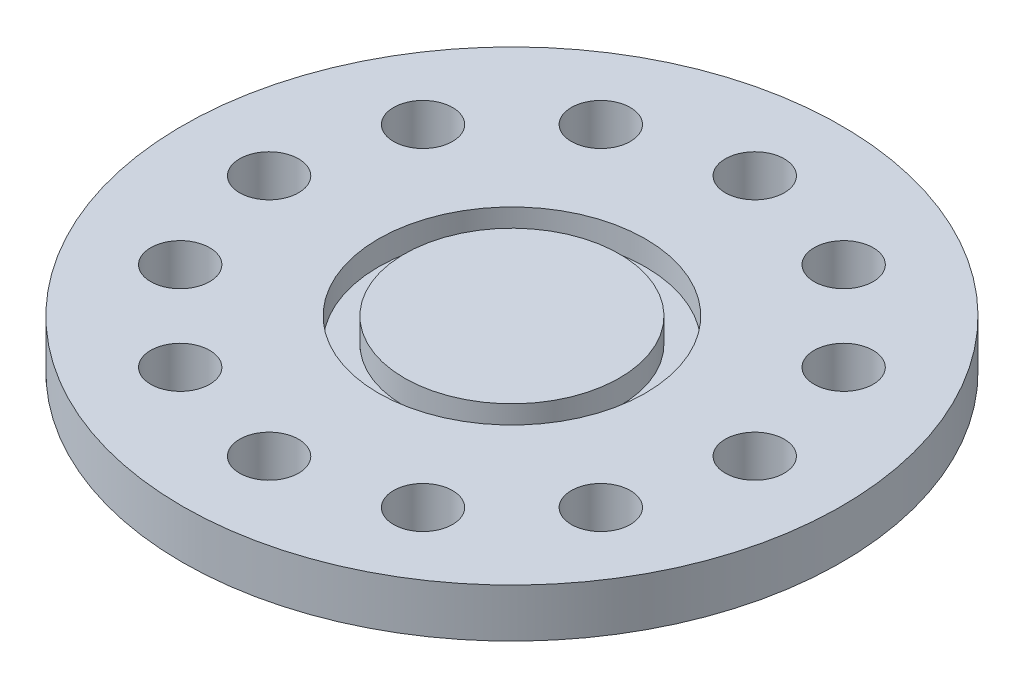
ISO-10303-21;
HEADER;
FILE_DESCRIPTION(('STEP AP214'),'2;1');
FILE_NAME('part.step','',(''),(''),'','','');
FILE_SCHEMA(('AUTOMOTIVE_DESIGN { 1 0 10303 214 1 1 1 1 }'));
ENDSEC;
DATA;
#1=APPLICATION_CONTEXT('core data for automotive mechanical design processes');
#2=APPLICATION_PROTOCOL_DEFINITION('international standard','automotive_design',2000,#1);
#3=PRODUCT_CONTEXT('',#1,'mechanical');
#4=PRODUCT('Part','Part','',(#3));
#5=PRODUCT_RELATED_PRODUCT_CATEGORY('part','',(#4));
#6=PRODUCT_DEFINITION_FORMATION('','',#4);
#7=PRODUCT_DEFINITION_CONTEXT('part definition',#1,'design');
#8=PRODUCT_DEFINITION('design','',#6,#7);
#9=PRODUCT_DEFINITION_SHAPE('','',#8);
#10=(LENGTH_UNIT() NAMED_UNIT(*) SI_UNIT(.MILLI.,.METRE.));
#11=(NAMED_UNIT(*) PLANE_ANGLE_UNIT() SI_UNIT($,.RADIAN.));
#12=(NAMED_UNIT(*) SI_UNIT($,.STERADIAN.) SOLID_ANGLE_UNIT());
#13=UNCERTAINTY_MEASURE_WITH_UNIT(LENGTH_MEASURE(1.E-05),#10,'distance_accuracy_value','');
#14=(GEOMETRIC_REPRESENTATION_CONTEXT(3) GLOBAL_UNCERTAINTY_ASSIGNED_CONTEXT((#13)) GLOBAL_UNIT_ASSIGNED_CONTEXT((#10,
#11,#12)) REPRESENTATION_CONTEXT('',''));
#15=CARTESIAN_POINT('',(0.,0.,0.));
#16=DIRECTION('',(0.,0.,1.));
#17=DIRECTION('',(1.,0.,0.));
#18=AXIS2_PLACEMENT_3D('',#15,#16,#17);
#19=CARTESIAN_POINT('',(0.,0.,0.));
#20=DIRECTION('',(0.,1.,0.));
#21=DIRECTION('',(0.,0.,1.));
#22=AXIS2_PLACEMENT_3D('',#19,#20,#21);
#23=PLANE('',#22);
#24=CARTESIAN_POINT('',(-3.50000000000008,0.,-6.06217782649107));
#25=DIRECTION('',(0.,1.,0.));
#26=DIRECTION('',(0.,0.,1.));
#27=AXIS2_PLACEMENT_3D('',#24,#25,#26);
#28=CIRCLE('',#27,0.850000000000142);
#29=CARTESIAN_POINT('',(-3.50000000000008,0.,-5.21217782649093));
#30=VERTEX_POINT('',#29);
#31=EDGE_CURVE('E110',#30,#30,#28,.T.);
#32=ORIENTED_EDGE('',*,*,#31,.T.);
#33=EDGE_LOOP('',(#32));
#34=FACE_BOUND('',#33,.T.);
#35=CARTESIAN_POINT('',(-6.06217782649122,0.,-3.49999999999996));
#36=DIRECTION('',(0.,1.,0.));
#37=DIRECTION('',(0.,0.,1.));
#38=AXIS2_PLACEMENT_3D('',#35,#36,#37);
#39=CIRCLE('',#38,0.850000000000153);
#40=CARTESIAN_POINT('',(-6.06217782649122,0.,-2.64999999999981));
#41=VERTEX_POINT('',#40);
#42=EDGE_CURVE('E116',#41,#41,#39,.T.);
#43=ORIENTED_EDGE('',*,*,#42,.T.);
#44=EDGE_LOOP('',(#43));
#45=FACE_BOUND('',#44,.T.);
#46=CARTESIAN_POINT('',(-7.00000000000019,0.,1.05656802751314E-13));
#47=DIRECTION('',(0.,1.,0.));
#48=DIRECTION('',(0.,0.,1.));
#49=AXIS2_PLACEMENT_3D('',#46,#47,#48);
#50=CIRCLE('',#49,0.850000000000116);
#51=CARTESIAN_POINT('',(-7.00000000000019,0.,0.850000000000221));
#52=VERTEX_POINT('',#51);
#53=EDGE_CURVE('E122',#52,#52,#50,.T.);
#54=ORIENTED_EDGE('',*,*,#53,.T.);
#55=EDGE_LOOP('',(#54));
#56=FACE_BOUND('',#55,.T.);
#57=CARTESIAN_POINT('',(-6.06217782649126,0.,3.50000000000019));
#58=DIRECTION('',(0.,1.,0.));
#59=DIRECTION('',(0.,0.,1.));
#60=AXIS2_PLACEMENT_3D('',#57,#58,#59);
#61=CIRCLE('',#60,0.850000000000052);
#62=CARTESIAN_POINT('',(-6.06217782649126,0.,4.35000000000024));
#63=VERTEX_POINT('',#62);
#64=EDGE_CURVE('E128',#63,#63,#61,.T.);
#65=ORIENTED_EDGE('',*,*,#64,.T.);
#66=EDGE_LOOP('',(#65));
#67=FACE_BOUND('',#66,.T.);
#68=CARTESIAN_POINT('',(-3.50000000000015,0.,6.06217782649133));
#69=DIRECTION('',(0.,1.,0.));
#70=DIRECTION('',(0.,0.,1.));
#71=AXIS2_PLACEMENT_3D('',#68,#69,#70);
#72=CIRCLE('',#71,0.849999999999964);
#73=CARTESIAN_POINT('',(-3.50000000000015,0.,6.91217782649129));
#74=VERTEX_POINT('',#73);
#75=EDGE_CURVE('E134',#74,#74,#72,.T.);
#76=ORIENTED_EDGE('',*,*,#75,.T.);
#77=EDGE_LOOP('',(#76));
#78=FACE_BOUND('',#77,.T.);
#79=CARTESIAN_POINT('',(0.,0.,7.00000000000029));
#80=DIRECTION('',(0.,1.,0.));
#81=DIRECTION('',(0.,0.,1.));
#82=AXIS2_PLACEMENT_3D('',#79,#80,#81);
#83=CIRCLE('',#82,0.849999999999879);
#84=CARTESIAN_POINT('',(0.,0.,7.85000000000017));
#85=VERTEX_POINT('',#84);
#86=EDGE_CURVE('E140',#85,#85,#83,.T.);
#87=ORIENTED_EDGE('',*,*,#86,.T.);
#88=EDGE_LOOP('',(#87));
#89=FACE_BOUND('',#88,.T.);
#90=CARTESIAN_POINT('',(3.5,0.,6.06217782649137));
#91=DIRECTION('',(0.,1.,0.));
#92=DIRECTION('',(0.,0.,1.));
#93=AXIS2_PLACEMENT_3D('',#90,#91,#92);
#94=CIRCLE('',#93,0.849999999999821);
#95=CARTESIAN_POINT('',(3.5,0.,6.91217782649119));
#96=VERTEX_POINT('',#95);
#97=EDGE_CURVE('E146',#96,#96,#94,.T.);
#98=ORIENTED_EDGE('',*,*,#97,.T.);
#99=EDGE_LOOP('',(#98));
#100=FACE_BOUND('',#99,.T.);
#101=CARTESIAN_POINT('',(6.06217782649114,0.,3.50000000000026));
#102=DIRECTION('',(0.,1.,0.));
#103=DIRECTION('',(0.,0.,1.));
#104=AXIS2_PLACEMENT_3D('',#101,#102,#103);
#105=CIRCLE('',#104,0.849999999999796);
#106=CARTESIAN_POINT('',(6.06217782649114,0.,4.35000000000005));
#107=VERTEX_POINT('',#106);
#108=EDGE_CURVE('E152',#107,#107,#105,.T.);
#109=ORIENTED_EDGE('',*,*,#108,.T.);
#110=EDGE_LOOP('',(#109));
#111=FACE_BOUND('',#110,.T.);
#112=CARTESIAN_POINT('',(7.0000000000001,0.,1.90103440924144E-13));
#113=DIRECTION('',(0.,1.,0.));
#114=DIRECTION('',(0.,0.,1.));
#115=AXIS2_PLACEMENT_3D('',#112,#113,#114);
#116=CIRCLE('',#115,0.849999999999811);
#117=CARTESIAN_POINT('',(7.0000000000001,0.,0.850000000000001));
#118=VERTEX_POINT('',#117);
#119=EDGE_CURVE('E158',#118,#118,#116,.T.);
#120=ORIENTED_EDGE('',*,*,#119,.T.);
#121=EDGE_LOOP('',(#120));
#122=FACE_BOUND('',#121,.T.);
#123=CARTESIAN_POINT('',(6.06217782649118,0.,-3.49999999999989));
#124=DIRECTION('',(0.,1.,0.));
#125=DIRECTION('',(0.,0.,1.));
#126=AXIS2_PLACEMENT_3D('',#123,#124,#125);
#127=CIRCLE('',#126,0.849999999999862);
#128=CARTESIAN_POINT('',(6.06217782649118,0.,-2.65000000000003));
#129=VERTEX_POINT('',#128);
#130=EDGE_CURVE('E164',#129,#129,#127,.T.);
#131=ORIENTED_EDGE('',*,*,#130,.T.);
#132=EDGE_LOOP('',(#131));
#133=FACE_BOUND('',#132,.T.);
#134=CARTESIAN_POINT('',(3.50000000000007,0.,-6.06217782649103));
#135=DIRECTION('',(0.,1.,0.));
#136=DIRECTION('',(0.,0.,1.));
#137=AXIS2_PLACEMENT_3D('',#134,#135,#136);
#138=CIRCLE('',#137,0.849999999999929);
#139=CARTESIAN_POINT('',(3.50000000000007,0.,-5.2121778264911));
#140=VERTEX_POINT('',#139);
#141=EDGE_CURVE('E170',#140,#140,#138,.T.);
#142=ORIENTED_EDGE('',*,*,#141,.T.);
#143=EDGE_LOOP('',(#142));
#144=FACE_BOUND('',#143,.T.);
#145=CARTESIAN_POINT('',(0.,0.,-7.));
#146=DIRECTION('',(0.,1.,0.));
#147=DIRECTION('',(0.,0.,1.));
#148=AXIS2_PLACEMENT_3D('',#145,#146,#147);
#149=CIRCLE('',#148,0.85);
#150=CARTESIAN_POINT('',(0.,0.,-6.15));
#151=VERTEX_POINT('',#150);
#152=EDGE_CURVE('E176',#151,#151,#149,.T.);
#153=ORIENTED_EDGE('',*,*,#152,.T.);
#154=EDGE_LOOP('',(#153));
#155=FACE_BOUND('',#154,.T.);
#156=CARTESIAN_POINT('',(0.,0.,0.));
#157=DIRECTION('',(0.,1.,0.));
#158=DIRECTION('',(0.,0.,1.));
#159=AXIS2_PLACEMENT_3D('',#156,#157,#158);
#160=CIRCLE('',#159,9.5);
#161=CARTESIAN_POINT('',(0.,0.,9.5));
#162=VERTEX_POINT('',#161);
#163=EDGE_CURVE('E37',#162,#162,#160,.T.);
#164=ORIENTED_EDGE('',*,*,#163,.F.);
#165=EDGE_LOOP('',(#164));
#166=FACE_BOUND('',#165,.T.);
#167=CARTESIAN_POINT('',(0.,0.,0.));
#168=DIRECTION('',(0.,-1.,0.));
#169=DIRECTION('',(0.,0.,-1.));
#170=AXIS2_PLACEMENT_3D('',#167,#168,#169);
#171=CIRCLE('',#170,3.);
#172=CARTESIAN_POINT('',(-0.8,0.,2.89136645896019));
#173=VERTEX_POINT('',#172);
#174=CARTESIAN_POINT('',(0.8,0.,2.89136645896019));
#175=VERTEX_POINT('',#174);
#176=EDGE_CURVE('E94',#173,#175,#171,.T.);
#177=ORIENTED_EDGE('',*,*,#176,.F.);
#178=DIRECTION('',(0.,0.,-1.));
#179=VECTOR('',#178,1.);
#180=CARTESIAN_POINT('',(-0.8,0.,2.89136645896019));
#181=LINE('',#180,#179);
#182=CARTESIAN_POINT('',(-0.8,0.,3.8));
#183=VERTEX_POINT('',#182);
#184=EDGE_CURVE('E91',#183,#173,#181,.T.);
#185=ORIENTED_EDGE('',*,*,#184,.F.);
#186=DIRECTION('',(-1.,0.,0.));
#187=VECTOR('',#186,1.);
#188=CARTESIAN_POINT('',(-0.8,0.,3.8));
#189=LINE('',#188,#187);
#190=CARTESIAN_POINT('',(0.8,0.,3.8));
#191=VERTEX_POINT('',#190);
#192=EDGE_CURVE('E53',#191,#183,#189,.T.);
#193=ORIENTED_EDGE('',*,*,#192,.F.);
#194=DIRECTION('',(0.,0.,1.));
#195=VECTOR('',#194,1.);
#196=CARTESIAN_POINT('',(0.8,0.,3.8));
#197=LINE('',#196,#195);
#198=EDGE_CURVE('E48',#175,#191,#197,.T.);
#199=ORIENTED_EDGE('',*,*,#198,.F.);
#200=EDGE_LOOP('',(#177,#185,#193,#199));
#201=FACE_BOUND('',#200,.T.);
#202=ADVANCED_FACE('F33',(#34,#45,#56,#67,#78,#89,#100,#111,#122,#133,#144,#155,#166,#201),#23,.F.);
#203=CARTESIAN_POINT('',(0.,1.4,0.));
#204=DIRECTION('',(0.,1.,0.));
#205=DIRECTION('',(0.,0.,1.));
#206=AXIS2_PLACEMENT_3D('',#203,#204,#205);
#207=PLANE('',#206);
#208=CARTESIAN_POINT('',(0.,1.4,0.));
#209=DIRECTION('',(0.,1.,0.));
#210=DIRECTION('',(0.,0.,1.));
#211=AXIS2_PLACEMENT_3D('',#208,#209,#210);
#212=CIRCLE('',#211,3.85);
#213=CARTESIAN_POINT('',(0.,1.4,3.85));
#214=VERTEX_POINT('',#213);
#215=EDGE_CURVE('E105',#214,#214,#212,.T.);
#216=ORIENTED_EDGE('',*,*,#215,.F.);
#217=EDGE_LOOP('',(#216));
#218=FACE_BOUND('',#217,.T.);
#219=CARTESIAN_POINT('',(-6.06217782649122,1.4,-3.49999999999996));
#220=DIRECTION('',(0.,1.,0.));
#221=DIRECTION('',(0.,0.,1.));
#222=AXIS2_PLACEMENT_3D('',#219,#220,#221);
#223=CIRCLE('',#222,0.850000000000153);
#224=CARTESIAN_POINT('',(-6.06217782649122,1.4,-2.64999999999981));
#225=VERTEX_POINT('',#224);
#226=EDGE_CURVE('E119',#225,#225,#223,.T.);
#227=ORIENTED_EDGE('',*,*,#226,.F.);
#228=EDGE_LOOP('',(#227));
#229=FACE_BOUND('',#228,.T.);
#230=CARTESIAN_POINT('',(-6.06217782649126,1.4,3.50000000000019));
#231=DIRECTION('',(0.,1.,0.));
#232=DIRECTION('',(0.,0.,1.));
#233=AXIS2_PLACEMENT_3D('',#230,#231,#232);
#234=CIRCLE('',#233,0.850000000000052);
#235=CARTESIAN_POINT('',(-6.06217782649126,1.4,4.35000000000024));
#236=VERTEX_POINT('',#235);
#237=EDGE_CURVE('E131',#236,#236,#234,.T.);
#238=ORIENTED_EDGE('',*,*,#237,.F.);
#239=EDGE_LOOP('',(#238));
#240=FACE_BOUND('',#239,.T.);
#241=CARTESIAN_POINT('',(0.,1.4,7.00000000000029));
#242=DIRECTION('',(0.,1.,0.));
#243=DIRECTION('',(0.,0.,1.));
#244=AXIS2_PLACEMENT_3D('',#241,#242,#243);
#245=CIRCLE('',#244,0.849999999999879);
#246=CARTESIAN_POINT('',(0.,1.4,7.85000000000017));
#247=VERTEX_POINT('',#246);
#248=EDGE_CURVE('E143',#247,#247,#245,.T.);
#249=ORIENTED_EDGE('',*,*,#248,.F.);
#250=EDGE_LOOP('',(#249));
#251=FACE_BOUND('',#250,.T.);
#252=CARTESIAN_POINT('',(6.06217782649114,1.4,3.50000000000026));
#253=DIRECTION('',(0.,1.,0.));
#254=DIRECTION('',(0.,0.,1.));
#255=AXIS2_PLACEMENT_3D('',#252,#253,#254);
#256=CIRCLE('',#255,0.849999999999796);
#257=CARTESIAN_POINT('',(6.06217782649114,1.4,4.35000000000005));
#258=VERTEX_POINT('',#257);
#259=EDGE_CURVE('E155',#258,#258,#256,.T.);
#260=ORIENTED_EDGE('',*,*,#259,.F.);
#261=EDGE_LOOP('',(#260));
#262=FACE_BOUND('',#261,.T.);
#263=CARTESIAN_POINT('',(6.06217782649118,1.4,-3.49999999999989));
#264=DIRECTION('',(0.,1.,0.));
#265=DIRECTION('',(0.,0.,1.));
#266=AXIS2_PLACEMENT_3D('',#263,#264,#265);
#267=CIRCLE('',#266,0.849999999999862);
#268=CARTESIAN_POINT('',(6.06217782649118,1.4,-2.65000000000003));
#269=VERTEX_POINT('',#268);
#270=EDGE_CURVE('E167',#269,#269,#267,.T.);
#271=ORIENTED_EDGE('',*,*,#270,.F.);
#272=EDGE_LOOP('',(#271));
#273=FACE_BOUND('',#272,.T.);
#274=CARTESIAN_POINT('',(0.,1.4,-7.));
#275=DIRECTION('',(0.,1.,0.));
#276=DIRECTION('',(0.,0.,1.));
#277=AXIS2_PLACEMENT_3D('',#274,#275,#276);
#278=CIRCLE('',#277,0.85);
#279=CARTESIAN_POINT('',(0.,1.4,-6.15));
#280=VERTEX_POINT('',#279);
#281=EDGE_CURVE('E179',#280,#280,#278,.T.);
#282=ORIENTED_EDGE('',*,*,#281,.F.);
#283=EDGE_LOOP('',(#282));
#284=FACE_BOUND('',#283,.T.);
#285=CARTESIAN_POINT('',(0.,1.4,0.));
#286=DIRECTION('',(0.,1.,0.));
#287=DIRECTION('',(0.,0.,1.));
#288=AXIS2_PLACEMENT_3D('',#285,#286,#287);
#289=CIRCLE('',#288,9.5);
#290=CARTESIAN_POINT('',(0.,1.4,9.5));
#291=VERTEX_POINT('',#290);
#292=EDGE_CURVE('E11',#291,#291,#289,.T.);
#293=ORIENTED_EDGE('',*,*,#292,.T.);
#294=EDGE_LOOP('',(#293));
#295=FACE_BOUND('',#294,.T.);
#296=CARTESIAN_POINT('',(3.50000000000007,1.4,-6.06217782649103));
#297=DIRECTION('',(0.,1.,0.));
#298=DIRECTION('',(0.,0.,1.));
#299=AXIS2_PLACEMENT_3D('',#296,#297,#298);
#300=CIRCLE('',#299,0.849999999999929);
#301=CARTESIAN_POINT('',(3.50000000000007,1.4,-5.2121778264911));
#302=VERTEX_POINT('',#301);
#303=EDGE_CURVE('E173',#302,#302,#300,.T.);
#304=ORIENTED_EDGE('',*,*,#303,.F.);
#305=EDGE_LOOP('',(#304));
#306=FACE_BOUND('',#305,.T.);
#307=CARTESIAN_POINT('',(7.0000000000001,1.4,1.90103440924144E-13));
#308=DIRECTION('',(0.,1.,0.));
#309=DIRECTION('',(0.,0.,1.));
#310=AXIS2_PLACEMENT_3D('',#307,#308,#309);
#311=CIRCLE('',#310,0.849999999999811);
#312=CARTESIAN_POINT('',(7.0000000000001,1.4,0.850000000000001));
#313=VERTEX_POINT('',#312);
#314=EDGE_CURVE('E161',#313,#313,#311,.T.);
#315=ORIENTED_EDGE('',*,*,#314,.F.);
#316=EDGE_LOOP('',(#315));
#317=FACE_BOUND('',#316,.T.);
#318=CARTESIAN_POINT('',(3.5,1.4,6.06217782649137));
#319=DIRECTION('',(0.,1.,0.));
#320=DIRECTION('',(0.,0.,1.));
#321=AXIS2_PLACEMENT_3D('',#318,#319,#320);
#322=CIRCLE('',#321,0.849999999999821);
#323=CARTESIAN_POINT('',(3.5,1.4,6.91217782649119));
#324=VERTEX_POINT('',#323);
#325=EDGE_CURVE('E149',#324,#324,#322,.T.);
#326=ORIENTED_EDGE('',*,*,#325,.F.);
#327=EDGE_LOOP('',(#326));
#328=FACE_BOUND('',#327,.T.);
#329=CARTESIAN_POINT('',(-3.50000000000015,1.4,6.06217782649133));
#330=DIRECTION('',(0.,1.,0.));
#331=DIRECTION('',(0.,0.,1.));
#332=AXIS2_PLACEMENT_3D('',#329,#330,#331);
#333=CIRCLE('',#332,0.849999999999964);
#334=CARTESIAN_POINT('',(-3.50000000000015,1.4,6.91217782649129));
#335=VERTEX_POINT('',#334);
#336=EDGE_CURVE('E137',#335,#335,#333,.T.);
#337=ORIENTED_EDGE('',*,*,#336,.F.);
#338=EDGE_LOOP('',(#337));
#339=FACE_BOUND('',#338,.T.);
#340=CARTESIAN_POINT('',(-7.00000000000019,1.4,1.05656802751314E-13));
#341=DIRECTION('',(0.,1.,0.));
#342=DIRECTION('',(0.,0.,1.));
#343=AXIS2_PLACEMENT_3D('',#340,#341,#342);
#344=CIRCLE('',#343,0.850000000000116);
#345=CARTESIAN_POINT('',(-7.00000000000019,1.4,0.850000000000221));
#346=VERTEX_POINT('',#345);
#347=EDGE_CURVE('E125',#346,#346,#344,.T.);
#348=ORIENTED_EDGE('',*,*,#347,.F.);
#349=EDGE_LOOP('',(#348));
#350=FACE_BOUND('',#349,.T.);
#351=CARTESIAN_POINT('',(-3.50000000000008,1.4,-6.06217782649107));
#352=DIRECTION('',(0.,1.,0.));
#353=DIRECTION('',(0.,0.,1.));
#354=AXIS2_PLACEMENT_3D('',#351,#352,#353);
#355=CIRCLE('',#354,0.850000000000142);
#356=CARTESIAN_POINT('',(-3.50000000000008,1.4,-5.21217782649093));
#357=VERTEX_POINT('',#356);
#358=EDGE_CURVE('E113',#357,#357,#355,.T.);
#359=ORIENTED_EDGE('',*,*,#358,.F.);
#360=EDGE_LOOP('',(#359));
#361=FACE_BOUND('',#360,.T.);
#362=ADVANCED_FACE('F199',(#218,#229,#240,#251,#262,#273,#284,#295,#306,#317,#328,#339,#350,
#361),#207,.T.);
#363=CARTESIAN_POINT('',(0.,1.4,0.));
#364=DIRECTION('',(0.,-1.,0.));
#365=DIRECTION('',(0.,0.,-1.));
#366=AXIS2_PLACEMENT_3D('',#363,#364,#365);
#367=CYLINDRICAL_SURFACE('',#366,9.5);
#368=ORIENTED_EDGE('',*,*,#292,.F.);
#369=EDGE_LOOP('',(#368));
#370=FACE_BOUND('',#369,.T.);
#371=ORIENTED_EDGE('',*,*,#163,.T.);
#372=EDGE_LOOP('',(#371));
#373=FACE_BOUND('',#372,.T.);
#374=ADVANCED_FACE('F35',(#370,#373),#367,.T.);
#375=CARTESIAN_POINT('',(0.,1.4,-7.));
#376=DIRECTION('',(0.,-1.,0.));
#377=DIRECTION('',(0.,0.,-1.));
#378=AXIS2_PLACEMENT_3D('',#375,#376,#377);
#379=CYLINDRICAL_SURFACE('',#378,0.85);
#380=ORIENTED_EDGE('',*,*,#281,.T.);
#381=EDGE_LOOP('',(#380));
#382=FACE_BOUND('',#381,.T.);
#383=ORIENTED_EDGE('',*,*,#152,.F.);
#384=EDGE_LOOP('',(#383));
#385=FACE_BOUND('',#384,.T.);
#386=ADVANCED_FACE('F187',(#382,#385),#379,.F.);
#387=CARTESIAN_POINT('',(3.50000000000007,1.4,-6.06217782649103));
#388=DIRECTION('',(0.,-1.,0.));
#389=DIRECTION('',(0.,0.,-1.));
#390=AXIS2_PLACEMENT_3D('',#387,#388,#389);
#391=CYLINDRICAL_SURFACE('',#390,0.849999999999929);
#392=ORIENTED_EDGE('',*,*,#303,.T.);
#393=EDGE_LOOP('',(#392));
#394=FACE_BOUND('',#393,.T.);
#395=ORIENTED_EDGE('',*,*,#141,.F.);
#396=EDGE_LOOP('',(#395));
#397=FACE_BOUND('',#396,.T.);
#398=ADVANCED_FACE('F189',(#394,#397),#391,.F.);
#399=CARTESIAN_POINT('',(6.06217782649118,1.4,-3.49999999999989));
#400=DIRECTION('',(0.,-1.,0.));
#401=DIRECTION('',(0.,0.,-1.));
#402=AXIS2_PLACEMENT_3D('',#399,#400,#401);
#403=CYLINDRICAL_SURFACE('',#402,0.849999999999862);
#404=ORIENTED_EDGE('',*,*,#270,.T.);
#405=EDGE_LOOP('',(#404));
#406=FACE_BOUND('',#405,.T.);
#407=ORIENTED_EDGE('',*,*,#130,.F.);
#408=EDGE_LOOP('',(#407));
#409=FACE_BOUND('',#408,.T.);
#410=ADVANCED_FACE('F196',(#406,#409),#403,.F.);
#411=CARTESIAN_POINT('',(7.0000000000001,1.4,1.90103440924144E-13));
#412=DIRECTION('',(0.,-1.,0.));
#413=DIRECTION('',(0.,0.,-1.));
#414=AXIS2_PLACEMENT_3D('',#411,#412,#413);
#415=CYLINDRICAL_SURFACE('',#414,0.849999999999811);
#416=ORIENTED_EDGE('',*,*,#314,.T.);
#417=EDGE_LOOP('',(#416));
#418=FACE_BOUND('',#417,.T.);
#419=ORIENTED_EDGE('',*,*,#119,.F.);
#420=EDGE_LOOP('',(#419));
#421=FACE_BOUND('',#420,.T.);
#422=ADVANCED_FACE('F233',(#418,#421),#415,.F.);
#423=CARTESIAN_POINT('',(6.06217782649114,1.4,3.50000000000026));
#424=DIRECTION('',(0.,-1.,0.));
#425=DIRECTION('',(0.,0.,-1.));
#426=AXIS2_PLACEMENT_3D('',#423,#424,#425);
#427=CYLINDRICAL_SURFACE('',#426,0.849999999999796);
#428=ORIENTED_EDGE('',*,*,#259,.T.);
#429=EDGE_LOOP('',(#428));
#430=FACE_BOUND('',#429,.T.);
#431=ORIENTED_EDGE('',*,*,#108,.F.);
#432=EDGE_LOOP('',(#431));
#433=FACE_BOUND('',#432,.T.);
#434=ADVANCED_FACE('F239',(#430,#433),#427,.F.);
#435=CARTESIAN_POINT('',(3.5,1.4,6.06217782649137));
#436=DIRECTION('',(0.,-1.,0.));
#437=DIRECTION('',(0.,0.,-1.));
#438=AXIS2_PLACEMENT_3D('',#435,#436,#437);
#439=CYLINDRICAL_SURFACE('',#438,0.849999999999821);
#440=ORIENTED_EDGE('',*,*,#325,.T.);
#441=EDGE_LOOP('',(#440));
#442=FACE_BOUND('',#441,.T.);
#443=ORIENTED_EDGE('',*,*,#97,.F.);
#444=EDGE_LOOP('',(#443));
#445=FACE_BOUND('',#444,.T.);
#446=ADVANCED_FACE('F245',(#442,#445),#439,.F.);
#447=CARTESIAN_POINT('',(0.,1.4,7.00000000000029));
#448=DIRECTION('',(0.,-1.,0.));
#449=DIRECTION('',(0.,0.,-1.));
#450=AXIS2_PLACEMENT_3D('',#447,#448,#449);
#451=CYLINDRICAL_SURFACE('',#450,0.849999999999879);
#452=ORIENTED_EDGE('',*,*,#248,.T.);
#453=EDGE_LOOP('',(#452));
#454=FACE_BOUND('',#453,.T.);
#455=ORIENTED_EDGE('',*,*,#86,.F.);
#456=EDGE_LOOP('',(#455));
#457=FACE_BOUND('',#456,.T.);
#458=ADVANCED_FACE('F249',(#454,#457),#451,.F.);
#459=CARTESIAN_POINT('',(-3.50000000000015,1.4,6.06217782649133));
#460=DIRECTION('',(0.,-1.,0.));
#461=DIRECTION('',(0.,0.,-1.));
#462=AXIS2_PLACEMENT_3D('',#459,#460,#461);
#463=CYLINDRICAL_SURFACE('',#462,0.849999999999964);
#464=ORIENTED_EDGE('',*,*,#336,.T.);
#465=EDGE_LOOP('',(#464));
#466=FACE_BOUND('',#465,.T.);
#467=ORIENTED_EDGE('',*,*,#75,.F.);
#468=EDGE_LOOP('',(#467));
#469=FACE_BOUND('',#468,.T.);
#470=ADVANCED_FACE('F253',(#466,#469),#463,.F.);
#471=CARTESIAN_POINT('',(-6.06217782649126,1.4,3.50000000000019));
#472=DIRECTION('',(0.,-1.,0.));
#473=DIRECTION('',(0.,0.,-1.));
#474=AXIS2_PLACEMENT_3D('',#471,#472,#473);
#475=CYLINDRICAL_SURFACE('',#474,0.850000000000052);
#476=ORIENTED_EDGE('',*,*,#237,.T.);
#477=EDGE_LOOP('',(#476));
#478=FACE_BOUND('',#477,.T.);
#479=ORIENTED_EDGE('',*,*,#64,.F.);
#480=EDGE_LOOP('',(#479));
#481=FACE_BOUND('',#480,.T.);
#482=ADVANCED_FACE('F257',(#478,#481),#475,.F.);
#483=CARTESIAN_POINT('',(-7.00000000000019,1.4,1.05656802751314E-13));
#484=DIRECTION('',(0.,-1.,0.));
#485=DIRECTION('',(0.,0.,-1.));
#486=AXIS2_PLACEMENT_3D('',#483,#484,#485);
#487=CYLINDRICAL_SURFACE('',#486,0.850000000000116);
#488=ORIENTED_EDGE('',*,*,#347,.T.);
#489=EDGE_LOOP('',(#488));
#490=FACE_BOUND('',#489,.T.);
#491=ORIENTED_EDGE('',*,*,#53,.F.);
#492=EDGE_LOOP('',(#491));
#493=FACE_BOUND('',#492,.T.);
#494=ADVANCED_FACE('F261',(#490,#493),#487,.F.);
#495=CARTESIAN_POINT('',(-6.06217782649122,1.4,-3.49999999999996));
#496=DIRECTION('',(0.,-1.,0.));
#497=DIRECTION('',(0.,0.,-1.));
#498=AXIS2_PLACEMENT_3D('',#495,#496,#497);
#499=CYLINDRICAL_SURFACE('',#498,0.850000000000153);
#500=ORIENTED_EDGE('',*,*,#226,.T.);
#501=EDGE_LOOP('',(#500));
#502=FACE_BOUND('',#501,.T.);
#503=ORIENTED_EDGE('',*,*,#42,.F.);
#504=EDGE_LOOP('',(#503));
#505=FACE_BOUND('',#504,.T.);
#506=ADVANCED_FACE('F265',(#502,#505),#499,.F.);
#507=CARTESIAN_POINT('',(-3.50000000000008,1.4,-6.06217782649107));
#508=DIRECTION('',(0.,-1.,0.));
#509=DIRECTION('',(0.,0.,-1.));
#510=AXIS2_PLACEMENT_3D('',#507,#508,#509);
#511=CYLINDRICAL_SURFACE('',#510,0.850000000000142);
#512=ORIENTED_EDGE('',*,*,#358,.T.);
#513=EDGE_LOOP('',(#512));
#514=FACE_BOUND('',#513,.T.);
#515=ORIENTED_EDGE('',*,*,#31,.F.);
#516=EDGE_LOOP('',(#515));
#517=FACE_BOUND('',#516,.T.);
#518=ADVANCED_FACE('F269',(#514,#517),#511,.F.);
#519=CARTESIAN_POINT('',(0.,0.7,0.));
#520=DIRECTION('',(0.,1.,0.));
#521=DIRECTION('',(0.,0.,1.));
#522=AXIS2_PLACEMENT_3D('',#519,#520,#521);
#523=CYLINDRICAL_SURFACE('',#522,3.85);
#524=CARTESIAN_POINT('',(0.,0.7,0.));
#525=DIRECTION('',(0.,1.,0.));
#526=DIRECTION('',(0.,0.,1.));
#527=AXIS2_PLACEMENT_3D('',#524,#525,#526);
#528=CIRCLE('',#527,3.85);
#529=CARTESIAN_POINT('',(0.,0.7,3.85));
#530=VERTEX_POINT('',#529);
#531=EDGE_CURVE('E107',#530,#530,#528,.T.);
#532=ORIENTED_EDGE('',*,*,#531,.F.);
#533=EDGE_LOOP('',(#532));
#534=FACE_BOUND('',#533,.T.);
#535=ORIENTED_EDGE('',*,*,#215,.T.);
#536=EDGE_LOOP('',(#535));
#537=FACE_BOUND('',#536,.T.);
#538=ADVANCED_FACE('F273',(#534,#537),#523,.F.);
#539=CARTESIAN_POINT('',(0.,0.7,0.));
#540=DIRECTION('',(0.,1.,0.));
#541=DIRECTION('',(0.,0.,1.));
#542=AXIS2_PLACEMENT_3D('',#539,#540,#541);
#543=PLANE('',#542);
#544=CARTESIAN_POINT('',(0.,0.7,0.));
#545=DIRECTION('',(0.,1.,0.));
#546=DIRECTION('',(0.,0.,1.));
#547=AXIS2_PLACEMENT_3D('',#544,#545,#546);
#548=CIRCLE('',#547,3.1);
#549=CARTESIAN_POINT('',(0.,0.7,3.1));
#550=VERTEX_POINT('',#549);
#551=EDGE_CURVE('E98',#550,#550,#548,.T.);
#552=ORIENTED_EDGE('',*,*,#551,.F.);
#553=EDGE_LOOP('',(#552));
#554=FACE_BOUND('',#553,.T.);
#555=ORIENTED_EDGE('',*,*,#531,.T.);
#556=EDGE_LOOP('',(#555));
#557=FACE_BOUND('',#556,.T.);
#558=ADVANCED_FACE('F277',(#554,#557),#543,.T.);
#559=CARTESIAN_POINT('',(0.,0.7,0.));
#560=DIRECTION('',(0.,1.,0.));
#561=DIRECTION('',(0.,0.,1.));
#562=AXIS2_PLACEMENT_3D('',#559,#560,#561);
#563=CYLINDRICAL_SURFACE('',#562,3.1);
#564=ORIENTED_EDGE('',*,*,#551,.T.);
#565=EDGE_LOOP('',(#564));
#566=FACE_BOUND('',#565,.T.);
#567=CARTESIAN_POINT('',(0.,1.4,0.));
#568=DIRECTION('',(0.,1.,0.));
#569=DIRECTION('',(0.,0.,1.));
#570=AXIS2_PLACEMENT_3D('',#567,#568,#569);
#571=CIRCLE('',#570,3.1);
#572=CARTESIAN_POINT('',(0.,1.4,3.1));
#573=VERTEX_POINT('',#572);
#574=EDGE_CURVE('E95',#573,#573,#571,.T.);
#575=ORIENTED_EDGE('',*,*,#574,.F.);
#576=EDGE_LOOP('',(#575));
#577=FACE_BOUND('',#576,.T.);
#578=ADVANCED_FACE('F281',(#566,#577),#563,.T.);
#579=ORIENTED_EDGE('',*,*,#574,.T.);
#580=EDGE_LOOP('',(#579));
#581=FACE_BOUND('',#580,.T.);
#582=ADVANCED_FACE('F208',(#581),#207,.T.);
#583=CARTESIAN_POINT('',(0.,-3.,0.));
#584=DIRECTION('',(0.,1.,0.));
#585=DIRECTION('',(0.,0.,1.));
#586=AXIS2_PLACEMENT_3D('',#583,#584,#585);
#587=CYLINDRICAL_SURFACE('',#586,3.);
#588=ORIENTED_EDGE('',*,*,#176,.T.);
#589=DIRECTION('',(0.,1.,0.));
#590=VECTOR('',#589,1.);
#591=CARTESIAN_POINT('',(0.8,-3.,2.89136645896019));
#592=LINE('',#591,#590);
#593=CARTESIAN_POINT('',(0.8,-3.,2.89136645896019));
#594=VERTEX_POINT('',#593);
#595=EDGE_CURVE('E75',#594,#175,#592,.T.);
#596=ORIENTED_EDGE('',*,*,#595,.F.);
#597=CARTESIAN_POINT('',(0.,-3.,0.));
#598=DIRECTION('',(0.,-1.,0.));
#599=DIRECTION('',(0.,0.,-1.));
#600=AXIS2_PLACEMENT_3D('',#597,#598,#599);
#601=CIRCLE('',#600,3.);
#602=CARTESIAN_POINT('',(-0.8,-3.,2.89136645896019));
#603=VERTEX_POINT('',#602);
#604=EDGE_CURVE('E82',#603,#594,#601,.T.);
#605=ORIENTED_EDGE('',*,*,#604,.F.);
#606=DIRECTION('',(0.,1.,0.));
#607=VECTOR('',#606,1.);
#608=CARTESIAN_POINT('',(-0.8,-3.,2.89136645896019));
#609=LINE('',#608,#607);
#610=EDGE_CURVE('E443',#603,#173,#609,.T.);
#611=ORIENTED_EDGE('',*,*,#610,.T.);
#612=EDGE_LOOP('',(#588,#596,#605,#611));
#613=FACE_BOUND('',#612,.T.);
#614=ADVANCED_FACE('F93',(#613),#587,.T.);
#615=CARTESIAN_POINT('',(0.8,-3.,3.8));
#616=DIRECTION('',(-1.,0.,0.));
#617=DIRECTION('',(0.,0.,1.));
#618=AXIS2_PLACEMENT_3D('',#615,#616,#617);
#619=PLANE('',#618);
#620=ORIENTED_EDGE('',*,*,#198,.T.);
#621=DIRECTION('',(0.,1.,0.));
#622=VECTOR('',#621,1.);
#623=CARTESIAN_POINT('',(0.8,-3.,3.8));
#624=LINE('',#623,#622);
#625=CARTESIAN_POINT('',(0.8,-3.,3.8));
#626=VERTEX_POINT('',#625);
#627=EDGE_CURVE('E78',#626,#191,#624,.T.);
#628=ORIENTED_EDGE('',*,*,#627,.F.);
#629=DIRECTION('',(0.,0.,1.));
#630=VECTOR('',#629,1.);
#631=CARTESIAN_POINT('',(0.8,-3.,3.8));
#632=LINE('',#631,#630);
#633=EDGE_CURVE('E71',#594,#626,#632,.T.);
#634=ORIENTED_EDGE('',*,*,#633,.F.);
#635=ORIENTED_EDGE('',*,*,#595,.T.);
#636=EDGE_LOOP('',(#620,#628,#634,#635));
#637=FACE_BOUND('',#636,.T.);
#638=ADVANCED_FACE('F73',(#637),#619,.F.);
#639=CARTESIAN_POINT('',(-0.8,-3.,3.8));
#640=DIRECTION('',(0.,0.,-1.));
#641=DIRECTION('',(-1.,0.,0.));
#642=AXIS2_PLACEMENT_3D('',#639,#640,#641);
#643=PLANE('',#642);
#644=ORIENTED_EDGE('',*,*,#192,.T.);
#645=DIRECTION('',(0.,1.,0.));
#646=VECTOR('',#645,1.);
#647=CARTESIAN_POINT('',(-0.8,-3.,3.8));
#648=LINE('',#647,#646);
#649=CARTESIAN_POINT('',(-0.8,-3.,3.8));
#650=VERTEX_POINT('',#649);
#651=EDGE_CURVE('E100',#650,#183,#648,.T.);
#652=ORIENTED_EDGE('',*,*,#651,.F.);
#653=DIRECTION('',(-1.,0.,0.));
#654=VECTOR('',#653,1.);
#655=CARTESIAN_POINT('',(-0.8,-3.,3.8));
#656=LINE('',#655,#654);
#657=EDGE_CURVE('E81',#626,#650,#656,.T.);
#658=ORIENTED_EDGE('',*,*,#657,.F.);
#659=ORIENTED_EDGE('',*,*,#627,.T.);
#660=EDGE_LOOP('',(#644,#652,#658,#659));
#661=FACE_BOUND('',#660,.T.);
#662=ADVANCED_FACE('F290',(#661),#643,.F.);
#663=CARTESIAN_POINT('',(-0.8,-3.,2.89136645896019));
#664=DIRECTION('',(1.,0.,0.));
#665=DIRECTION('',(0.,0.,-1.));
#666=AXIS2_PLACEMENT_3D('',#663,#664,#665);
#667=PLANE('',#666);
#668=ORIENTED_EDGE('',*,*,#184,.T.);
#669=ORIENTED_EDGE('',*,*,#610,.F.);
#670=DIRECTION('',(0.,0.,-1.));
#671=VECTOR('',#670,1.);
#672=CARTESIAN_POINT('',(-0.8,-3.,2.89136645896019));
#673=LINE('',#672,#671);
#674=EDGE_CURVE('E87',#650,#603,#673,.T.);
#675=ORIENTED_EDGE('',*,*,#674,.F.);
#676=ORIENTED_EDGE('',*,*,#651,.T.);
#677=EDGE_LOOP('',(#668,#669,#675,#676));
#678=FACE_BOUND('',#677,.T.);
#679=ADVANCED_FACE('F293',(#678),#667,.F.);
#680=CARTESIAN_POINT('',(0.,-3.,0.));
#681=DIRECTION('',(0.,-1.,0.));
#682=DIRECTION('',(0.,0.,-1.));
#683=AXIS2_PLACEMENT_3D('',#680,#681,#682);
#684=PLANE('',#683);
#685=ORIENTED_EDGE('',*,*,#604,.T.);
#686=ORIENTED_EDGE('',*,*,#633,.T.);
#687=ORIENTED_EDGE('',*,*,#657,.T.);
#688=ORIENTED_EDGE('',*,*,#674,.T.);
#689=EDGE_LOOP('',(#685,#686,#687,#688));
#690=FACE_BOUND('',#689,.T.);
#691=ADVANCED_FACE('F85',(#690),#684,.T.);
#692=CLOSED_SHELL('',(#202,#362,#374,#386,#398,#410,#422,#434,#446,#458,#470,#482,#494,#506,
#518,#538,#558,#578,#582,#614,#638,#662,#679,#691));
#693=MANIFOLD_SOLID_BREP('B2',#692);
#694=ADVANCED_BREP_SHAPE_REPRESENTATION('',(#18,#693),#14);
#695=SHAPE_DEFINITION_REPRESENTATION(#9,#694);
ENDSEC;
END-ISO-10303-21;
